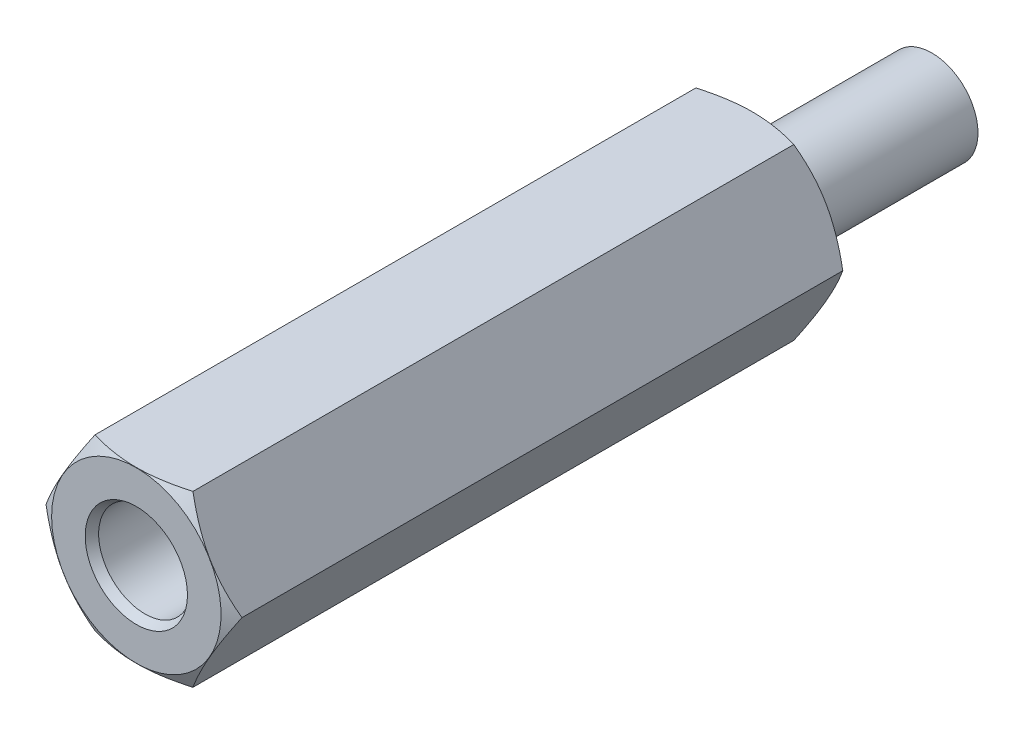
ISO-10303-21;
HEADER;
FILE_DESCRIPTION(('STEP AP214'),'2;1');
FILE_NAME('part.step','',(''),(''),'','','');
FILE_SCHEMA(('AUTOMOTIVE_DESIGN { 1 0 10303 214 1 1 1 1 }'));
ENDSEC;
DATA;
#1=APPLICATION_CONTEXT('core data for automotive mechanical design processes');
#2=APPLICATION_PROTOCOL_DEFINITION('international standard','automotive_design',2000,#1);
#3=PRODUCT_CONTEXT('',#1,'mechanical');
#4=PRODUCT('Part','Part','',(#3));
#5=PRODUCT_RELATED_PRODUCT_CATEGORY('part','',(#4));
#6=PRODUCT_DEFINITION_FORMATION('','',#4);
#7=PRODUCT_DEFINITION_CONTEXT('part definition',#1,'design');
#8=PRODUCT_DEFINITION('design','',#6,#7);
#9=PRODUCT_DEFINITION_SHAPE('','',#8);
#10=(LENGTH_UNIT() NAMED_UNIT(*) SI_UNIT(.MILLI.,.METRE.));
#11=(NAMED_UNIT(*) PLANE_ANGLE_UNIT() SI_UNIT($,.RADIAN.));
#12=(NAMED_UNIT(*) SI_UNIT($,.STERADIAN.) SOLID_ANGLE_UNIT());
#13=UNCERTAINTY_MEASURE_WITH_UNIT(LENGTH_MEASURE(1.E-05),#10,'distance_accuracy_value','');
#14=(GEOMETRIC_REPRESENTATION_CONTEXT(3) GLOBAL_UNCERTAINTY_ASSIGNED_CONTEXT((#13)) GLOBAL_UNIT_ASSIGNED_CONTEXT((#10,
#11,#12)) REPRESENTATION_CONTEXT('',''));
#15=CARTESIAN_POINT('',(0.,0.,0.));
#16=DIRECTION('',(0.,0.,1.));
#17=DIRECTION('',(1.,0.,0.));
#18=AXIS2_PLACEMENT_3D('',#15,#16,#17);
#19=CARTESIAN_POINT('',(0.,0.,-6.));
#20=DIRECTION('',(0.,0.,1.));
#21=DIRECTION('',(1.,0.,0.));
#22=AXIS2_PLACEMENT_3D('',#19,#20,#21);
#23=PLANE('',#22);
#24=CARTESIAN_POINT('',(0.,0.,-6.00000000001986));
#25=DIRECTION('',(0.,0.,1.));
#26=DIRECTION('',(1.,0.,0.));
#27=AXIS2_PLACEMENT_3D('',#24,#25,#26);
#28=CIRCLE('',#27,1.19000000000824);
#29=CARTESIAN_POINT('',(1.19000000000824,0.,-6.00000000001986));
#30=VERTEX_POINT('',#29);
#31=EDGE_CURVE('E19',#30,#30,#28,.T.);
#32=ORIENTED_EDGE('',*,*,#31,.F.);
#33=EDGE_LOOP('',(#32));
#34=FACE_BOUND('',#33,.T.);
#35=ADVANCED_FACE('F16',(#34),#23,.F.);
#36=CARTESIAN_POINT('',(0.,0.,14.00000000001));
#37=DIRECTION('',(0.,0.,1.));
#38=DIRECTION('',(1.,0.,0.));
#39=AXIS2_PLACEMENT_3D('',#36,#37,#38);
#40=CONICAL_SURFACE('',#39,1.50000000002137,1.0471975511292);
#41=CARTESIAN_POINT('',(0.,0.,14.));
#42=DIRECTION('',(0.,0.,-1.));
#43=DIRECTION('',(-1.,0.,0.));
#44=AXIS2_PLACEMENT_3D('',#41,#42,#43);
#45=CIRCLE('',#44,1.5);
#46=CARTESIAN_POINT('',(-1.5,0.,14.));
#47=VERTEX_POINT('',#46);
#48=EDGE_CURVE('E237',#47,#47,#45,.F.);
#49=ORIENTED_EDGE('',*,*,#48,.T.);
#50=EDGE_LOOP('',(#49));
#51=FACE_BOUND('',#50,.T.);
#52=CARTESIAN_POINT('',(-1.13686837721616E-10,0.,13.1339745961441));
#53=VERTEX_POINT('',#52);
#54=VERTEX_LOOP('',#53);
#55=FACE_BOUND('',#54,.T.);
#56=ADVANCED_FACE('F74',(#51,#55),#40,.F.);
#57=CARTESIAN_POINT('',(0.,0.,-5.82102141663654));
#58=DIRECTION('',(0.,0.,1.));
#59=DIRECTION('',(1.,0.,0.));
#60=AXIS2_PLACEMENT_3D('',#57,#58,#59);
#61=CONICAL_SURFACE('',#60,1.49999999990769,1.04719755121454);
#62=CARTESIAN_POINT('',(0.,0.,-5.821021416551));
#63=DIRECTION('',(0.,0.,1.));
#64=DIRECTION('',(1.,0.,0.));
#65=AXIS2_PLACEMENT_3D('',#62,#63,#64);
#66=CIRCLE('',#65,1.5);
#67=CARTESIAN_POINT('',(1.5,0.,-5.821021416551));
#68=VERTEX_POINT('',#67);
#69=EDGE_CURVE('E232',#68,#68,#66,.T.);
#70=ORIENTED_EDGE('',*,*,#69,.F.);
#71=EDGE_LOOP('',(#70));
#72=FACE_BOUND('',#71,.T.);
#73=ORIENTED_EDGE('',*,*,#31,.T.);
#74=EDGE_LOOP('',(#73));
#75=FACE_BOUND('',#74,.T.);
#76=ADVANCED_FACE('F76',(#72,#75),#61,.T.);
#77=CARTESIAN_POINT('',(0.,0.,19.722871870789));
#78=DIRECTION('',(0.,0.,-1.));
#79=DIRECTION('',(-1.,0.,0.));
#80=AXIS2_PLACEMENT_3D('',#77,#78,#79);
#81=CYLINDRICAL_SURFACE('',#80,1.5);
#82=ORIENTED_EDGE('',*,*,#48,.F.);
#83=EDGE_LOOP('',(#82));
#84=FACE_BOUND('',#83,.T.);
#85=CARTESIAN_POINT('',(0.,0.,19.7228718707265));
#86=DIRECTION('',(0.,0.,1.));
#87=DIRECTION('',(1.,0.,0.));
#88=AXIS2_PLACEMENT_3D('',#85,#86,#87);
#89=CIRCLE('',#88,1.50000000002137);
#90=CARTESIAN_POINT('',(1.50000000002137,0.,19.7228718707265));
#91=VERTEX_POINT('',#90);
#92=EDGE_CURVE('E236',#91,#91,#89,.T.);
#93=ORIENTED_EDGE('',*,*,#92,.T.);
#94=EDGE_LOOP('',(#93));
#95=FACE_BOUND('',#94,.T.);
#96=ADVANCED_FACE('F83',(#84,#95),#81,.F.);
#97=CARTESIAN_POINT('',(0.,0.,-5.821021416551));
#98=DIRECTION('',(0.,0.,1.));
#99=DIRECTION('',(1.,0.,0.));
#100=AXIS2_PLACEMENT_3D('',#97,#98,#99);
#101=CYLINDRICAL_SURFACE('',#100,1.5);
#102=CARTESIAN_POINT('',(0.,0.,0.));
#103=DIRECTION('',(0.,0.,1.));
#104=DIRECTION('',(1.,0.,0.));
#105=AXIS2_PLACEMENT_3D('',#102,#103,#104);
#106=CIRCLE('',#105,1.5);
#107=CARTESIAN_POINT('',(1.5,0.,0.));
#108=VERTEX_POINT('',#107);
#109=EDGE_CURVE('E241',#108,#108,#106,.F.);
#110=ORIENTED_EDGE('',*,*,#109,.T.);
#111=EDGE_LOOP('',(#110));
#112=FACE_BOUND('',#111,.T.);
#113=ORIENTED_EDGE('',*,*,#69,.T.);
#114=EDGE_LOOP('',(#113));
#115=FACE_BOUND('',#114,.T.);
#116=ADVANCED_FACE('F307',(#112,#115),#101,.T.);
#117=CARTESIAN_POINT('',(0.,0.,19.999999999925));
#118=DIRECTION('',(0.,0.,1.));
#119=DIRECTION('',(1.,0.,0.));
#120=AXIS2_PLACEMENT_3D('',#117,#118,#119);
#121=CONICAL_SURFACE('',#120,1.66000000001532,0.523598775601555);
#122=ORIENTED_EDGE('',*,*,#92,.F.);
#123=EDGE_LOOP('',(#122));
#124=FACE_BOUND('',#123,.T.);
#125=CARTESIAN_POINT('',(0.,0.,19.999999999925));
#126=DIRECTION('',(0.,0.,1.));
#127=DIRECTION('',(1.,0.,0.));
#128=AXIS2_PLACEMENT_3D('',#125,#126,#127);
#129=CIRCLE('',#128,1.66000000001532);
#130=CARTESIAN_POINT('',(1.66000000001532,0.,19.999999999925));
#131=VERTEX_POINT('',#130);
#132=EDGE_CURVE('E231',#131,#131,#129,.F.);
#133=ORIENTED_EDGE('',*,*,#132,.F.);
#134=EDGE_LOOP('',(#133));
#135=FACE_BOUND('',#134,.T.);
#136=ADVANCED_FACE('F299',(#124,#135),#121,.F.);
#137=CARTESIAN_POINT('',(0.,0.,0.));
#138=DIRECTION('',(0.,0.,1.));
#139=DIRECTION('',(1.,0.,0.));
#140=AXIS2_PLACEMENT_3D('',#137,#138,#139);
#141=PLANE('',#140);
#142=CARTESIAN_POINT('',(0.,0.,-1.52311431696195E-11));
#143=DIRECTION('',(0.,0.,1.));
#144=DIRECTION('',(1.,0.,0.));
#145=AXIS2_PLACEMENT_3D('',#142,#143,#144);
#146=CIRCLE('',#145,2.74999999993497);
#147=CARTESIAN_POINT('',(2.74999999993497,0.,-1.52311431696195E-11));
#148=VERTEX_POINT('',#147);
#149=EDGE_CURVE('E228',#148,#148,#146,.T.);
#150=ORIENTED_EDGE('',*,*,#149,.F.);
#151=EDGE_LOOP('',(#150));
#152=FACE_BOUND('',#151,.T.);
#153=ORIENTED_EDGE('',*,*,#109,.F.);
#154=EDGE_LOOP('',(#153));
#155=FACE_BOUND('',#154,.T.);
#156=ADVANCED_FACE('F293',(#152,#155),#141,.F.);
#157=CARTESIAN_POINT('',(1.59,-2.753960784035,-10.));
#158=DIRECTION('',(-0.866025403784329,0.50000000000019,0.));
#159=DIRECTION('',(-0.50000000000019,-0.866025403784329,0.));
#160=AXIS2_PLACEMENT_3D('',#157,#158,#159);
#161=PLANE('',#160);
#162=CARTESIAN_POINT('',(1.58999998333896,-2.75396081289276,19.7517393746369));
#163=CARTESIAN_POINT('',(1.65987085421975,-2.63294091455821,19.7920910351792));
#164=CARTESIAN_POINT('',(1.73034484946333,-2.51087637418404,19.8287887587152));
#165=CARTESIAN_POINT('',(1.87251305005783,-2.26463382753383,19.8928435332352));
#166=CARTESIAN_POINT('',(1.94420978064042,-2.14045144742828,19.9201779265413));
#167=CARTESIAN_POINT('',(2.086714740184,-1.89362561716837,19.9627258807932));
#168=CARTESIAN_POINT('',(2.15750104907167,-1.77102013369472,19.9782226549626));
#169=CARTESIAN_POINT('',(2.29940656608261,-1.52523256835757,19.9967191103024));
#170=CARTESIAN_POINT('',(2.37052525877176,-1.40205137925215,19.9997341118108));
#171=CARTESIAN_POINT('',(2.50340290541381,-1.17190054407805,19.9934458621831));
#172=CARTESIAN_POINT('',(2.56518179873882,-1.06489636200382,19.9856865853286));
#173=CARTESIAN_POINT('',(2.68833711608123,-0.8515850951446,19.9610992040127));
#174=CARTESIAN_POINT('',(2.74971311445526,-0.745278747595561,19.9442627087704));
#175=CARTESIAN_POINT('',(2.87312214339913,-0.531528039352149,19.9021747289858));
#176=CARTESIAN_POINT('',(2.9351395627711,-0.424110718045645,19.876744919484));
#177=CARTESIAN_POINT('',(3.05824967925965,-0.210877741361873,19.8190300024668));
#178=CARTESIAN_POINT('',(3.11934395234234,-0.105059356331221,19.786758446955));
#179=CARTESIAN_POINT('',(3.17999997641852,-4.08461953016775E-08,19.7517393978711));
#180=B_SPLINE_CURVE_WITH_KNOTS('',3,(#162,#163,#164,#165,#166,#167,#168,#169,#170,#171,#172,
#173,#174,#175,#176,#177,#178,#179),.UNSPECIFIED.,.F.,.F.,(4,2,2,2,2,2,2,2,4),(0.,
0.436524834070014,0.874098643473581,1.3008438564624,1.72706511960836,2.09811574293672,
2.46950994685165,2.84913989435269,3.22802478856777),.UNSPECIFIED.);
#181=CARTESIAN_POINT('',(1.58999995671776,-2.753960784035,19.7517393967506));
#182=VERTEX_POINT('',#181);
#183=CARTESIAN_POINT('',(3.17999998822002,-2.0423096423144E-08,19.7517393910394));
#184=VERTEX_POINT('',#183);
#185=EDGE_CURVE('E192',#182,#184,#180,.T.);
#186=ORIENTED_EDGE('',*,*,#185,.F.);
#187=DIRECTION('',(0.,0.,1.));
#188=VECTOR('',#187,1.);
#189=CARTESIAN_POINT('',(1.59,-2.753960784035,-10.));
#190=LINE('',#189,#188);
#191=CARTESIAN_POINT('',(1.58999999167965,-2.75396079844628,0.248260620579857));
#192=VERTEX_POINT('',#191);
#193=EDGE_CURVE('E224',#182,#192,#190,.F.);
#194=ORIENTED_EDGE('',*,*,#193,.T.);
#195=CARTESIAN_POINT('',(3.17999997396859,-1.38043565660934E-08,0.24826061880916));
#196=CARTESIAN_POINT('',(3.11012911256683,-0.121019915769744,0.207908953215328));
#197=CARTESIAN_POINT('',(3.03965512121165,-0.243084457633775,0.171211228361298));
#198=CARTESIAN_POINT('',(2.89748692355303,-0.489327005229111,0.107156454645271));
#199=CARTESIAN_POINT('',(2.82579019200708,-0.613509384783673,0.0798220634610996));
#200=CARTESIAN_POINT('',(2.68328523199397,-0.860335214278304,0.0372741127463411));
#201=CARTESIAN_POINT('',(2.61249892356692,-0.982940697525742,0.0217773399991891));
#202=CARTESIAN_POINT('',(2.47059340717891,-1.22872826219922,0.00328088774374463));
#203=CARTESIAN_POINT('',(2.39947471465223,-1.35190945086776,0.000265887901627008));
#204=CARTESIAN_POINT('',(2.26659706726036,-1.58206028724326,0.0065541405188458));
#205=CARTESIAN_POINT('',(2.20481817300529,-1.68906447096149,0.0143134189096583));
#206=CARTESIAN_POINT('',(2.081662853854,-1.90237574097821,0.0389008034590945));
#207=CARTESIAN_POINT('',(2.02028685460111,-2.00868209004078,0.0557373003974788));
#208=CARTESIAN_POINT('',(1.89687782385849,-2.22243280139259,0.0978252836647863));
#209=CARTESIAN_POINT('',(1.83486040356875,-2.32985012429052,0.123255094964128));
#210=CARTESIAN_POINT('',(1.71175028527326,-2.54308310410762,0.180970015555322));
#211=CARTESIAN_POINT('',(1.65065601130143,-2.64890149068009,0.213241572844589));
#212=CARTESIAN_POINT('',(1.58999998634231,-2.75396080769081,0.248260623661368));
#213=B_SPLINE_CURVE_WITH_KNOTS('',3,(#195,#196,#197,#198,#199,#200,#201,#202,#203,#204,#205,
#206,#207,#208,#209,#210,#211,#212),.UNSPECIFIED.,.F.,.F.,(4,2,2,2,2,2,2,2,4),(0.,
0.436524833133789,0.874098641209254,1.30084385252974,1.7270651141625,2.09811574343271,
2.46950995323602,2.8491399072231,3.22802480796484),.UNSPECIFIED.);
#214=CARTESIAN_POINT('',(3.17999998887964,-3.43587439186097E-13,0.248260609355515));
#215=VERTEX_POINT('',#214);
#216=EDGE_CURVE('E137',#215,#192,#213,.T.);
#217=ORIENTED_EDGE('',*,*,#216,.F.);
#218=DIRECTION('',(0.,0.,1.));
#219=VECTOR('',#218,1.);
#220=CARTESIAN_POINT('',(3.18,0.,-10.));
#221=LINE('',#220,#219);
#222=EDGE_CURVE('E69',#215,#184,#221,.T.);
#223=ORIENTED_EDGE('',*,*,#222,.T.);
#224=EDGE_LOOP('',(#186,#194,#217,#223));
#225=FACE_BOUND('',#224,.T.);
#226=ADVANCED_FACE('F291',(#225),#161,.F.);
#227=CARTESIAN_POINT('',(0.,0.,20.));
#228=DIRECTION('',(0.,0.,1.));
#229=DIRECTION('',(1.,0.,0.));
#230=AXIS2_PLACEMENT_3D('',#227,#228,#229);
#231=PLANE('',#230);
#232=ORIENTED_EDGE('',*,*,#132,.T.);
#233=EDGE_LOOP('',(#232));
#234=FACE_BOUND('',#233,.T.);
#235=CARTESIAN_POINT('',(0.,0.,19.9999999999818));
#236=DIRECTION('',(0.,0.,-1.));
#237=DIRECTION('',(-1.,0.,0.));
#238=AXIS2_PLACEMENT_3D('',#235,#236,#237);
#239=CIRCLE('',#238,2.75000000004866);
#240=CARTESIAN_POINT('',(-2.75000000004866,0.,19.9999999999818));
#241=VERTEX_POINT('',#240);
#242=EDGE_CURVE('E182',#241,#241,#239,.T.);
#243=ORIENTED_EDGE('',*,*,#242,.F.);
#244=EDGE_LOOP('',(#243));
#245=FACE_BOUND('',#244,.T.);
#246=ADVANCED_FACE('F172',(#234,#245),#231,.T.);
#247=CARTESIAN_POINT('',(3.18,0.,-10.));
#248=DIRECTION('',(-0.866025403784329,-0.50000000000019,0.));
#249=DIRECTION('',(0.50000000000019,-0.866025403784329,0.));
#250=AXIS2_PLACEMENT_3D('',#247,#248,#249);
#251=PLANE('',#250);
#252=CARTESIAN_POINT('',(3.18000000139617,-2.41824180085523E-09,19.7517393834503));
#253=CARTESIAN_POINT('',(3.11012913075496,0.121019895501353,19.792091043279));
#254=CARTESIAN_POINT('',(3.03965513575239,0.243084435458088,19.8287887660547));
#255=CARTESIAN_POINT('',(2.89748693566253,0.489326981234225,19.8928435389918));
#256=CARTESIAN_POINT('',(2.82579020534371,0.613509360882919,19.9201779314758));
#257=CARTESIAN_POINT('',(2.68328524635552,0.860335190180858,19.9627258840829));
#258=CARTESIAN_POINT('',(2.61249893775883,0.982940673150511,19.9782226574309));
#259=CARTESIAN_POINT('',(2.47059342136476,1.22872823741922,19.9967191111901));
#260=CARTESIAN_POINT('',(2.39947472900144,1.35190942596028,19.999734111939));
#261=CARTESIAN_POINT('',(2.26659708027095,1.58206026475167,19.9934458608899));
#262=CARTESIAN_POINT('',(2.20481818453379,1.68906445100388,19.9856865829311));
#263=CARTESIAN_POINT('',(2.08166286242661,1.90237572611592,19.9610991987797));
#264=CARTESIAN_POINT('',(2.02028686170009,2.00868207773958,19.9442627018046));
#265=CARTESIAN_POINT('',(1.89687782800902,2.22243279420538,19.9021747180418));
#266=CARTESIAN_POINT('',(1.83486040624491,2.32985011965519,19.8767449062754));
#267=CARTESIAN_POINT('',(1.71175028506481,2.54308310446498,19.8190299844282));
#268=CARTESIAN_POINT('',(1.65065600968236,2.64890149347894,19.7867584263533));
#269=CARTESIAN_POINT('',(1.58999998333695,2.75396081289437,19.7517393746366));
#270=B_SPLINE_CURVE_WITH_KNOTS('',3,(#252,#253,#254,#255,#256,#257,#258,#259,#260,#261,#262,
#263,#264,#265,#266,#267,#268,#269),.UNSPECIFIED.,.F.,.F.,(4,2,2,2,2,2,2,2,4),(0.,
0.436524832091969,0.874098639474673,1.30084385045859,1.72706511161198,2.09811574955086,
2.46950996812944,2.84913993104239,3.22802484054455),.UNSPECIFIED.);
#271=CARTESIAN_POINT('',(1.58999999166847,2.75396079846469,19.7517393794464));
#272=VERTEX_POINT('',#271);
#273=EDGE_CURVE('E175',#184,#272,#270,.T.);
#274=ORIENTED_EDGE('',*,*,#273,.F.);
#275=ORIENTED_EDGE('',*,*,#222,.F.);
#276=CARTESIAN_POINT('',(1.5900000000059,2.75396078402406,0.248260615771663));
#277=CARTESIAN_POINT('',(1.65987087061415,2.63294088616081,0.20790895601478));
#278=CARTESIAN_POINT('',(1.73034486558367,2.51087634626101,0.171211233314138));
#279=CARTESIAN_POINT('',(1.87251306560382,2.26463380060539,0.107156460530141));
#280=CARTESIAN_POINT('',(1.94420979588595,2.14045142102034,0.0798220681238967));
#281=CARTESIAN_POINT('',(2.08671475482122,1.89362559181412,0.0372741156608292));
#282=CARTESIAN_POINT('',(2.15750106340203,1.77102010887195,0.0217773423826878));
#283=CARTESIAN_POINT('',(2.29940657976312,1.52523254466035,0.00328088876190168));
#284=CARTESIAN_POINT('',(2.37052527210934,1.4020513561489,0.00026588808183248));
#285=CARTESIAN_POINT('',(2.50340291827952,1.1719005217921,0.0065541391295979));
#286=CARTESIAN_POINT('',(2.56518181147922,1.06489633993492,0.0143134166252823));
#287=CARTESIAN_POINT('',(2.68833712855181,0.851585073543032,0.0389007991312518));
#288=CARTESIAN_POINT('',(2.74971312678133,0.745278726244305,0.0557372949224358));
#289=CARTESIAN_POINT('',(2.87312215541947,0.531528018530435,0.0978252757015208));
#290=CARTESIAN_POINT('',(2.93513957463011,0.42411069750336,0.123255085645778));
#291=CARTESIAN_POINT('',(3.05824969079566,0.210877721379033,0.180970003434768));
#292=CARTESIAN_POINT('',(3.11934396371669,0.105059336628378,0.213241559276042));
#293=CARTESIAN_POINT('',(3.17999998763536,2.14161886420593E-08,0.248260608637126));
#294=B_SPLINE_CURVE_WITH_KNOTS('',3,(#276,#277,#278,#279,#280,#281,#282,#283,#284,#285,#286,
#287,#288,#289,#290,#291,#292,#293),.UNSPECIFIED.,.F.,.F.,(4,2,2,2,2,2,2,2,4),(0.,
0.436524831843872,0.874098638966052,1.30084384983303,1.72706511087677,2.09811573357995,
2.4695099368664,2.84913988369187,3.22802477722835),.UNSPECIFIED.);
#295=CARTESIAN_POINT('',(1.59000000000272,2.75396078402934,0.248260615774056));
#296=VERTEX_POINT('',#295);
#297=EDGE_CURVE('E159',#296,#215,#294,.T.);
#298=ORIENTED_EDGE('',*,*,#297,.F.);
#299=DIRECTION('',(0.,0.,1.));
#300=VECTOR('',#299,1.);
#301=CARTESIAN_POINT('',(1.59,2.753960784035,-10.));
#302=LINE('',#301,#300);
#303=EDGE_CURVE('E205',#296,#272,#302,.T.);
#304=ORIENTED_EDGE('',*,*,#303,.T.);
#305=EDGE_LOOP('',(#274,#275,#298,#304));
#306=FACE_BOUND('',#305,.T.);
#307=ADVANCED_FACE('F168',(#306),#251,.F.);
#308=CARTESIAN_POINT('',(-1.59,-2.753960784035,-10.));
#309=DIRECTION('',(0.,1.,0.));
#310=DIRECTION('',(-1.,0.,0.));
#311=AXIS2_PLACEMENT_3D('',#308,#309,#310);
#312=PLANE('',#311);
#313=CARTESIAN_POINT('',(-1.59000000000756,-2.75396078403715,19.7517393842553));
#314=CARTESIAN_POINT('',(-1.45025825881012,-2.75396078403577,19.7920910440063));
#315=CARTESIAN_POINT('',(-1.30931026889088,-2.75396078403521,19.8287887667024));
#316=CARTESIAN_POINT('',(-1.02497386889372,-2.75396078403479,19.8928435394801));
#317=CARTESIAN_POINT('',(-0.881580408352856,-2.75396078403495,19.9201779318848));
#318=CARTESIAN_POINT('',(-0.596570490485391,-2.75396078403505,19.9627258843557));
#319=CARTESIAN_POINT('',(-0.454997873302909,-2.75396078403502,19.9782226576397));
#320=CARTESIAN_POINT('',(-0.171186840535274,-2.75396078403499,19.996719111268));
#321=CARTESIAN_POINT('',(-0.0289494558182211,-2.753960784035,19.9997341119495));
#322=CARTESIAN_POINT('',(0.236805831323367,-2.753960784035,19.9934458610272));
#323=CARTESIAN_POINT('',(0.360363612510564,-2.753960784035,19.9856865840652));
#324=CARTESIAN_POINT('',(0.606674236318025,-2.753960784035,19.9610992033603));
#325=CARTESIAN_POINT('',(0.729426227651714,-2.753960784035,19.9442627088382));
#326=CARTESIAN_POINT('',(0.97624427455867,-2.753960784035,19.9021747312232));
#327=CARTESIAN_POINT('',(1.10027910774107,-2.753960784035,19.8767449231969));
#328=CARTESIAN_POINT('',(1.34649932978501,-2.753960784035,19.8190300096609));
#329=CARTESIAN_POINT('',(1.46868787057812,-2.753960784035,19.7867584561521));
#330=CARTESIAN_POINT('',(1.58999991343729,-2.753960784035,19.7517394092446));
#331=B_SPLINE_CURVE_WITH_KNOTS('',3,(#313,#314,#315,#316,#317,#318,#319,#320,#321,#322,#323,
#324,#325,#326,#327,#328,#329,#330),.UNSPECIFIED.,.F.,.F.,(4,2,2,2,2,2,2,2,4),(0.,
0.436524831782477,0.874098638835293,1.30084384976707,1.72706511088143,2.09811571792594,
2.46950990549578,2.84913983578847,3.22802471291805),.UNSPECIFIED.);
#332=CARTESIAN_POINT('',(-1.59000000000319,-2.75396078403477,19.7517393842553));
#333=VERTEX_POINT('',#332);
#334=EDGE_CURVE('E199',#333,#182,#331,.T.);
#335=ORIENTED_EDGE('',*,*,#334,.F.);
#336=DIRECTION('',(0.,0.,1.));
#337=VECTOR('',#336,1.);
#338=CARTESIAN_POINT('',(-1.58999999999919,-2.75396078403453,-10.));
#339=LINE('',#338,#337);
#340=CARTESIAN_POINT('',(-1.5899999483793,-2.7539607984406,0.248260608077285));
#341=VERTEX_POINT('',#340);
#342=EDGE_CURVE('E118',#333,#341,#339,.F.);
#343=ORIENTED_EDGE('',*,*,#342,.T.);
#344=CARTESIAN_POINT('',(1.58999991336773,-2.75396078402463,0.248260590774307));
#345=CARTESIAN_POINT('',(1.45025817360475,-2.75396078403128,0.207908933064435));
#346=CARTESIAN_POINT('',(1.30931018512826,-2.753960784034,0.171211212541441));
#347=CARTESIAN_POINT('',(1.02497378815621,-2.753960784036,0.107156444280703));
#348=CARTESIAN_POINT('',(0.881580329198601,-2.75396078403527,0.0798220542172953));
#349=CARTESIAN_POINT('',(0.596570414495038,-2.75396078403474,0.0372741063897429));
#350=CARTESIAN_POINT('',(0.454997798887531,-2.75396078403493,0.0217773354170055));
#351=CARTESIAN_POINT('',(0.171186769454119,-2.75396078403507,0.00328088625075607));
#352=CARTESIAN_POINT('',(0.0289493864959675,-2.75396078403502,0.00026588772163869));
#353=CARTESIAN_POINT('',(-0.236805893284857,-2.75396078403499,0.0065541422177231));
#354=CARTESIAN_POINT('',(-0.360363668899679,-2.753960784035,0.0143134203426638));
#355=CARTESIAN_POINT('',(-0.606674281544353,-2.753960784035,0.0389008024415196));
#356=CARTESIAN_POINT('',(-0.729426267287754,-2.753960784035,0.0557372971925545));
#357=CARTESIAN_POINT('',(-0.976244302815418,-2.753960784035,0.0978252744059585));
#358=CARTESIAN_POINT('',(-1.10027913021302,-2.753960784035,0.123255081771713));
#359=CARTESIAN_POINT('',(-1.3464993408656,-2.753960784035,0.18096999329924));
#360=CARTESIAN_POINT('',(-1.46868787605155,-2.753960784035,0.213241545462854));
#361=CARTESIAN_POINT('',(-1.58999991339191,-2.753960784035,0.248260590774495));
#362=B_SPLINE_CURVE_WITH_KNOTS('',3,(#344,#345,#346,#347,#348,#349,#350,#351,#352,#353,#354,
#355,#356,#357,#358,#359,#360,#361),.UNSPECIFIED.,.F.,.F.,(4,2,2,2,2,2,2,2,4),(0.,
0.436524825940365,0.87409862699963,1.30084383247872,1.72706508819706,2.09811567883283,
2.46950984993052,2.84913976285845,3.22802462273429),.UNSPECIFIED.);
#363=EDGE_CURVE('E164',#192,#341,#362,.T.);
#364=ORIENTED_EDGE('',*,*,#363,.F.);
#365=ORIENTED_EDGE('',*,*,#193,.F.);
#366=EDGE_LOOP('',(#335,#343,#364,#365));
#367=FACE_BOUND('',#366,.T.);
#368=ADVANCED_FACE('F129',(#367),#312,.F.);
#369=CARTESIAN_POINT('',(0.,0.,0.249750179364128));
#370=DIRECTION('',(0.,0.,1.));
#371=DIRECTION('',(1.,0.,0.));
#372=AXIS2_PLACEMENT_3D('',#369,#370,#371);
#373=CONICAL_SURFACE('',#372,3.18257999981597,1.0471975511931);
#374=ORIENTED_EDGE('',*,*,#149,.T.);
#375=EDGE_LOOP('',(#374));
#376=FACE_BOUND('',#375,.T.);
#377=CARTESIAN_POINT('',(-1.58999999999358,2.753960784035,0.248260615774245));
#378=CARTESIAN_POINT('',(-1.45025825876833,2.753960784035,0.207908956014688));
#379=CARTESIAN_POINT('',(-1.30931026882081,2.753960784035,0.171211233311884));
#380=CARTESIAN_POINT('',(-1.02497386876255,2.753960784035,0.107156460524643));
#381=CARTESIAN_POINT('',(-0.88158040818882,2.753960784035,0.0798220681173888));
#382=CARTESIAN_POINT('',(-0.596570490316665,2.753960784035,0.037274115656707));
#383=CARTESIAN_POINT('',(-0.454997873163127,2.753960784035,0.0217773423805486));
#384=CARTESIAN_POINT('',(-0.171186840458612,2.753960784035,0.00328088876204281));
#385=CARTESIAN_POINT('',(-0.0289494557757476,2.753960784035,0.000265888082204055));
#386=CARTESIAN_POINT('',(0.236805838643735,2.753960784035,0.00655413917956549));
#387=CARTESIAN_POINT('',(0.360363627127337,2.753960784035,0.014313416888394));
#388=CARTESIAN_POINT('',(0.606674265406346,2.753960784035,0.0389008001140449));
#389=CARTESIAN_POINT('',(0.72942626391489,2.753960784035,0.0557372964124613));
#390=CARTESIAN_POINT('',(0.976244325337635,2.753960784035,0.097825278456361));
#391=CARTESIAN_POINT('',(1.10027916585384,2.753960784035,0.123255089167364));
#392=CARTESIAN_POINT('',(1.34649940229856,2.753960784035,0.180970008656633));
#393=CARTESIAN_POINT('',(1.46868795015961,2.753960784035,0.213241565430427));
#394=CARTESIAN_POINT('',(1.58999999998761,2.753960784035,0.248260615772521));
#395=B_SPLINE_CURVE_WITH_KNOTS('',3,(#377,#378,#379,#380,#381,#382,#383,#384,#385,#386,#387,
#388,#389,#390,#391,#392,#393,#394),.UNSPECIFIED.,.F.,.F.,(4,2,2,2,2,2,2,2,4),(0.,
0.436524831869503,0.874098639020526,1.30084384986262,1.72706511087916,2.09811573984399,
2.46950994941524,2.8491399028519,3.22802480294923),.UNSPECIFIED.);
#396=CARTESIAN_POINT('',(-1.58999999999679,2.753960784035,0.248260615775172));
#397=VERTEX_POINT('',#396);
#398=EDGE_CURVE('E153',#397,#296,#395,.T.);
#399=ORIENTED_EDGE('',*,*,#398,.T.);
#400=ORIENTED_EDGE('',*,*,#297,.T.);
#401=ORIENTED_EDGE('',*,*,#216,.T.);
#402=ORIENTED_EDGE('',*,*,#363,.T.);
#403=CARTESIAN_POINT('',(-1.58999995415964,-2.7539607884303,0.248260648042423));
#404=CARTESIAN_POINT('',(-1.65987084502112,-2.63294090355196,0.207908972257527));
#405=CARTESIAN_POINT('',(-1.73034484910585,-2.51087636758179,0.171211242228811));
#406=CARTESIAN_POINT('',(-1.87251305746037,-2.26463382194726,0.107156462706956));
#407=CARTESIAN_POINT('',(-1.94420978693643,-2.14045143843722,0.0798220708949529));
#408=CARTESIAN_POINT('',(-2.08671474675676,-1.89362560391372,0.0372741179729117));
#409=CARTESIAN_POINT('',(-2.15750105695939,-1.77102011953286,0.0217773436494862));
#410=CARTESIAN_POINT('',(-2.29940657594966,-1.52523255176291,0.00328088883301796));
#411=CARTESIAN_POINT('',(-2.37052526930435,-1.40205136113203,0.00026588800980116));
#412=CARTESIAN_POINT('',(-2.50340291766989,-1.17190052273941,0.00655413904768036));
#413=CARTESIAN_POINT('',(-2.5651818120327,-1.06489633894699,0.0143134166639053));
#414=CARTESIAN_POINT('',(-2.68833713134713,-0.851585068730696,0.0389007997613044));
#415=CARTESIAN_POINT('',(-2.74971313065551,-0.745278719542472,0.0557372960198704));
#416=CARTESIAN_POINT('',(-2.87312216161437,-0.531528007791908,0.0978252780434568));
#417=CARTESIAN_POINT('',(-2.93513958206457,-0.424110684622184,0.123255088791483));
#418=CARTESIAN_POINT('',(-3.05824970070673,-0.21087770421685,0.180970008420283));
#419=CARTESIAN_POINT('',(-3.11934397486445,-0.1050593173285,0.21324156530104));
#420=CARTESIAN_POINT('',(-3.17999999999702,-5.15245385756975E-12,0.248260615774138));
#421=B_SPLINE_CURVE_WITH_KNOTS('',3,(#403,#404,#405,#406,#407,#408,#409,#410,#411,#412,#413,
#414,#415,#416,#417,#418,#419,#420),.UNSPECIFIED.,.F.,.F.,(4,2,2,2,2,2,2,2,4),(0.,
0.43652484067426,0.874098655957902,1.30084387346468,1.72706514142599,2.09811577091452,
2.46950998083559,2.84913993541198,3.228024836897),.UNSPECIFIED.);
#422=CARTESIAN_POINT('',(-3.17999999999731,4.43770699134382E-13,0.248260615774304));
#423=VERTEX_POINT('',#422);
#424=EDGE_CURVE('E147',#341,#423,#421,.T.);
#425=ORIENTED_EDGE('',*,*,#424,.T.);
#426=CARTESIAN_POINT('',(-3.1799999999976,6.03989005755136E-12,0.248260615774469));
#427=CARTESIAN_POINT('',(-3.11012912938494,0.121019897876174,0.207908956014897));
#428=CARTESIAN_POINT('',(-3.03965513441115,0.243084437783078,0.171211233312078));
#429=CARTESIAN_POINT('',(-2.89748693438194,0.489326983454145,0.107156460524806));
#430=CARTESIAN_POINT('',(-2.82579020409504,0.613509363047557,0.0798220681175361));
#431=CARTESIAN_POINT('',(-2.6832852451589,0.860335192255356,0.037274115656825));
#432=CARTESIAN_POINT('',(-2.61249893658209,0.982940675190564,0.0217773423806529));
#433=CARTESIAN_POINT('',(-2.47059342022977,1.22872823938696,0.00328088876211953));
#434=CARTESIAN_POINT('',(-2.3994747278883,1.35190942789018,0.000265888082267011));
#435=CARTESIAN_POINT('',(-2.26659708067824,1.5820602640481,0.00655413917961821));
#436=CARTESIAN_POINT('',(-2.20481818643616,1.68906444771076,0.0143134168884896));
#437=CARTESIAN_POINT('',(-2.08166286729609,1.90237571768361,0.0389008001142998));
#438=CARTESIAN_POINT('',(-2.02028686804154,2.00868206675775,0.0557372964128328));
#439=CARTESIAN_POINT('',(-1.8968778373296,2.22243277806355,0.0978252784570293));
#440=CARTESIAN_POINT('',(-1.83486041707121,2.32985010090538,0.123255089168215));
#441=CARTESIAN_POINT('',(-1.71175029884828,2.54308308059319,0.180970008657893));
#442=CARTESIAN_POINT('',(-1.65065602491748,2.64890146709281,0.213241565431913));
#443=CARTESIAN_POINT('',(-1.59000000000321,2.75396078402944,0.248260615774245));
#444=B_SPLINE_CURVE_WITH_KNOTS('',3,(#426,#427,#428,#429,#430,#431,#432,#433,#434,#435,#436,
#437,#438,#439,#440,#441,#442,#443),.UNSPECIFIED.,.F.,.F.,(4,2,2,2,2,2,2,2,4),(0.,
0.436524831869562,0.874098639020644,1.30084384986279,1.72706511087937,2.09811573984576,
2.46950994941858,2.84913990285689,3.22802480295586),.UNSPECIFIED.);
#445=EDGE_CURVE('E109',#423,#397,#444,.T.);
#446=ORIENTED_EDGE('',*,*,#445,.T.);
#447=EDGE_LOOP('',(#399,#400,#401,#402,#425,#446));
#448=FACE_BOUND('',#447,.T.);
#449=ADVANCED_FACE('F123',(#376,#448),#373,.T.);
#450=CARTESIAN_POINT('',(1.59,2.753960784035,-10.));
#451=DIRECTION('',(0.,-1.,0.));
#452=DIRECTION('',(1.,0.,0.));
#453=AXIS2_PLACEMENT_3D('',#450,#451,#452);
#454=PLANE('',#453);
#455=CARTESIAN_POINT('',(1.58999991343514,2.75396078404682,19.751739409253));
#456=CARTESIAN_POINT('',(1.45025817367011,2.75396078403924,19.7920910669553));
#457=CARTESIAN_POINT('',(1.30931018519292,2.75396078403614,19.8287887874761));
#458=CARTESIAN_POINT('',(1.02497378822041,2.75396078403386,19.8928435557372));
#459=CARTESIAN_POINT('',(0.881580329263045,2.7539607840347,19.9201779458032));
#460=CARTESIAN_POINT('',(0.596570414559427,2.7539607840353,19.9627258936349));
#461=CARTESIAN_POINT('',(0.454997798951627,2.75396078403508,19.9782226646093));
#462=CARTESIAN_POINT('',(0.17118676951762,2.75396078403492,19.9967191137791));
#463=CARTESIAN_POINT('',(0.0289493865591666,2.75396078403498,19.9997341123102));
#464=CARTESIAN_POINT('',(-0.236805893226966,2.75396078403502,19.9934458578175));
#465=CARTESIAN_POINT('',(-0.360363668846762,2.75396078403501,19.9856865796937));
#466=CARTESIAN_POINT('',(-0.606674281501435,2.753960784035,19.9610991975962));
#467=CARTESIAN_POINT('',(-0.72942626724986,2.753960784035,19.9442627028454));
#468=CARTESIAN_POINT('',(-0.976244302787605,2.753960784035,19.9021747256318));
#469=CARTESIAN_POINT('',(-1.10027913019026,2.753960784035,19.8767449182655));
#470=CARTESIAN_POINT('',(-1.34649934085275,2.753960784035,19.8190300067363));
#471=CARTESIAN_POINT('',(-1.46868787604355,2.753960784035,19.7867584545716));
#472=CARTESIAN_POINT('',(-1.58999991338868,2.753960784035,19.7517394092587));
#473=B_SPLINE_CURVE_WITH_KNOTS('',3,(#455,#456,#457,#458,#459,#460,#461,#462,#463,#464,#465,
#466,#467,#468,#469,#470,#471,#472),.UNSPECIFIED.,.F.,.F.,(4,2,2,2,2,2,2,2,4),(0.,
0.436524825940766,0.874098627000975,1.30084383248137,1.72706508820078,2.09811567885117,
2.46950984996365,2.84913976290671,3.22802462279744),.UNSPECIFIED.);
#474=CARTESIAN_POINT('',(-1.58999994836573,2.75396079846057,19.7517393919489));
#475=VERTEX_POINT('',#474);
#476=EDGE_CURVE('E181',#272,#475,#473,.T.);
#477=ORIENTED_EDGE('',*,*,#476,.F.);
#478=ORIENTED_EDGE('',*,*,#303,.F.);
#479=ORIENTED_EDGE('',*,*,#398,.F.);
#480=DIRECTION('',(0.,0.,1.));
#481=VECTOR('',#480,1.);
#482=CARTESIAN_POINT('',(-1.59,2.753960784035,-10.));
#483=LINE('',#482,#481);
#484=EDGE_CURVE('E117',#397,#475,#483,.T.);
#485=ORIENTED_EDGE('',*,*,#484,.T.);
#486=EDGE_LOOP('',(#477,#478,#479,#485));
#487=FACE_BOUND('',#486,.T.);
#488=ADVANCED_FACE('F128',(#487),#454,.F.);
#489=CARTESIAN_POINT('',(0.,0.,19.750249820504));
#490=DIRECTION('',(0.,0.,-1.));
#491=DIRECTION('',(-1.,0.,0.));
#492=AXIS2_PLACEMENT_3D('',#489,#490,#491);
#493=CONICAL_SURFACE('',#492,3.18258000010019,1.0471975511931);
#494=ORIENTED_EDGE('',*,*,#242,.T.);
#495=EDGE_LOOP('',(#494));
#496=FACE_BOUND('',#495,.T.);
#497=CARTESIAN_POINT('',(-1.58999998334279,2.75396081288614,19.7517393746391));
#498=CARTESIAN_POINT('',(-1.65987085423118,2.63294091453843,19.7920910351856));
#499=CARTESIAN_POINT('',(-1.73034484948244,2.51087637415093,19.828788758725));
#500=CARTESIAN_POINT('',(-1.87251305009355,2.26463382747197,19.8928435332501));
#501=CARTESIAN_POINT('',(-1.94420978068505,2.14045144735097,19.9201779265576));
#502=CARTESIAN_POINT('',(-2.08671474022985,1.89362561708896,19.9627258808039));
#503=CARTESIAN_POINT('',(-2.15750104910961,1.77102013362902,19.978222654969));
#504=CARTESIAN_POINT('',(-2.29940656610329,1.52523256832175,19.9967191103036));
#505=CARTESIAN_POINT('',(-2.3705252587831,1.40205137923252,19.9997341118111));
#506=CARTESIAN_POINT('',(-2.50340290740824,1.1719005406236,19.9934458620881));
#507=CARTESIAN_POINT('',(-2.5651818027214,1.06489635510577,19.9856865848265));
#508=CARTESIAN_POINT('',(-2.6883371240071,0.851585081416589,19.9610992021369));
#509=CARTESIAN_POINT('',(-2.74971312433618,0.745278730481317,19.9442627059266));
#510=CARTESIAN_POINT('',(-2.87312215723538,0.531528015387063,19.9021747237284));
#511=CARTESIAN_POINT('',(-2.9351395786057,0.424110690619312,19.8767449127635));
#512=CARTESIAN_POINT('',(-3.05824969901824,0.210877707138986,19.819029992502));
#513=CARTESIAN_POINT('',(-3.11934397402683,0.105059318772569,19.7867584352109));
#514=CARTESIAN_POINT('',(-3.18000000000192,-1.44449794372292E-12,19.7517393842553));
#515=B_SPLINE_CURVE_WITH_KNOTS('',3,(#497,#498,#499,#500,#501,#502,#503,#504,#505,#506,#507,
#508,#509,#510,#511,#512,#513,#514),.UNSPECIFIED.,.F.,.F.,(4,2,2,2,2,2,2,2,4),(0.,
0.43652483411722,0.874098643574109,1.3008438565139,1.72706511960638,2.09811575488066,
2.46950997078571,2.84913993089949,3.22802483763129),.UNSPECIFIED.);
#516=CARTESIAN_POINT('',(-3.18000000000107,1.32259284797766E-12,19.7517393842557));
#517=VERTEX_POINT('',#516);
#518=EDGE_CURVE('E26',#475,#517,#515,.T.);
#519=ORIENTED_EDGE('',*,*,#518,.T.);
#520=CARTESIAN_POINT('',(-3.18000000000129,2.23413985367542E-12,19.7517393842556));
#521=CARTESIAN_POINT('',(-3.11012912938857,-0.121019897868,19.7920910440154));
#522=CARTESIAN_POINT('',(-3.03965513441472,-0.243084437775005,19.8287887667184));
#523=CARTESIAN_POINT('',(-2.8974869343854,-0.489326983446286,19.8928435395062));
#524=CARTESIAN_POINT('',(-2.82579020409843,-0.613509363039812,19.9201779319137));
#525=CARTESIAN_POINT('',(-2.68328524516216,-0.860335192247829,19.9627258843749));
#526=CARTESIAN_POINT('',(-2.61249893658529,-0.982940675183141,19.9782226576513));
#527=CARTESIAN_POINT('',(-2.47059342023284,-1.22872823937976,19.9967191112704));
#528=CARTESIAN_POINT('',(-2.3994747278913,-1.3519094278831,19.9997341119505));
#529=CARTESIAN_POINT('',(-2.26659708068025,-1.58206026404275,19.9934458608535));
#530=CARTESIAN_POINT('',(-2.20481818643724,-1.68906444770701,19.9856865831446));
#531=CARTESIAN_POINT('',(-2.08166286729533,-1.90237571768304,19.9610991999185));
#532=CARTESIAN_POINT('',(-2.02028686803986,-2.00868206675877,19.9442627036197));
#533=CARTESIAN_POINT('',(-1.89687783732607,-2.22243277806778,19.9021747215747));
#534=CARTESIAN_POINT('',(-1.83486041706674,-2.32985010091123,19.876744910863));
#535=CARTESIAN_POINT('',(-1.71175029884197,-2.54308308060223,19.8190299913721));
#536=CARTESIAN_POINT('',(-1.65065602491027,-2.64890146710342,19.7867584345973));
#537=CARTESIAN_POINT('',(-1.5899999999951,-2.7539607840416,19.7517393842542));
#538=B_SPLINE_CURVE_WITH_KNOTS('',3,(#520,#521,#522,#523,#524,#525,#526,#527,#528,#529,#530,
#531,#532,#533,#534,#535,#536,#537),.UNSPECIFIED.,.F.,.F.,(4,2,2,2,2,2,2,2,4),(0.,
0.436524831870072,0.874098639021684,1.30084384986427,1.72706511088128,2.09811573985319,
2.46950994943154,2.84913990287568,3.22802480298044),.UNSPECIFIED.);
#539=EDGE_CURVE('E34',#517,#333,#538,.T.);
#540=ORIENTED_EDGE('',*,*,#539,.T.);
#541=ORIENTED_EDGE('',*,*,#334,.T.);
#542=ORIENTED_EDGE('',*,*,#185,.T.);
#543=ORIENTED_EDGE('',*,*,#273,.T.);
#544=ORIENTED_EDGE('',*,*,#476,.T.);
#545=EDGE_LOOP('',(#519,#540,#541,#542,#543,#544));
#546=FACE_BOUND('',#545,.T.);
#547=ADVANCED_FACE('F96',(#496,#546),#493,.T.);
#548=CARTESIAN_POINT('',(-3.18,0.,-10.));
#549=DIRECTION('',(0.866025403784329,0.50000000000019,0.));
#550=DIRECTION('',(-0.50000000000019,0.866025403784329,0.));
#551=AXIS2_PLACEMENT_3D('',#548,#549,#550);
#552=PLANE('',#551);
#553=ORIENTED_EDGE('',*,*,#539,.F.);
#554=DIRECTION('',(0.,0.,1.));
#555=VECTOR('',#554,1.);
#556=CARTESIAN_POINT('',(-3.18000000000085,4.10695782937509E-13,-10.));
#557=LINE('',#556,#555);
#558=EDGE_CURVE('E10',#517,#423,#557,.F.);
#559=ORIENTED_EDGE('',*,*,#558,.T.);
#560=ORIENTED_EDGE('',*,*,#424,.F.);
#561=ORIENTED_EDGE('',*,*,#342,.F.);
#562=EDGE_LOOP('',(#553,#559,#560,#561));
#563=FACE_BOUND('',#562,.T.);
#564=ADVANCED_FACE('F90',(#563),#552,.F.);
#565=CARTESIAN_POINT('',(-1.59,2.753960784035,-10.));
#566=DIRECTION('',(0.866025403784329,-0.50000000000019,0.));
#567=DIRECTION('',(0.50000000000019,0.866025403784329,0.));
#568=AXIS2_PLACEMENT_3D('',#565,#566,#567);
#569=PLANE('',#568);
#570=ORIENTED_EDGE('',*,*,#518,.F.);
#571=ORIENTED_EDGE('',*,*,#484,.F.);
#572=ORIENTED_EDGE('',*,*,#445,.F.);
#573=ORIENTED_EDGE('',*,*,#558,.F.);
#574=EDGE_LOOP('',(#570,#571,#572,#573));
#575=FACE_BOUND('',#574,.T.);
#576=ADVANCED_FACE('F88',(#575),#569,.F.);
#577=CLOSED_SHELL('',(#35,#56,#76,#96,#116,#136,#156,#226,#246,#307,#368,#449,#488,#547,#564,#576));
#578=MANIFOLD_SOLID_BREP('B1',#577);
#579=ADVANCED_BREP_SHAPE_REPRESENTATION('',(#18,#578),#14);
#580=SHAPE_DEFINITION_REPRESENTATION(#9,#579);
ENDSEC;
END-ISO-10303-21;
